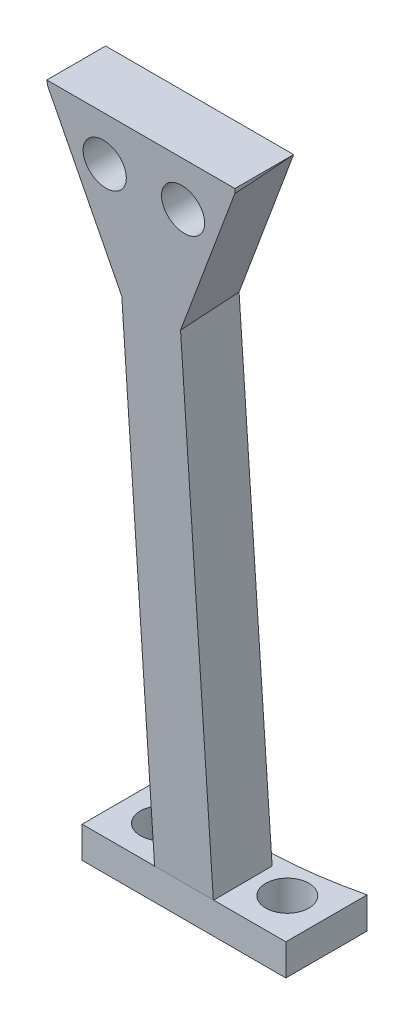
ISO-10303-21;
HEADER;
FILE_DESCRIPTION(('STEP AP214'),'2;1');
FILE_NAME('part.step','',(''),(''),'','','');
FILE_SCHEMA(('AUTOMOTIVE_DESIGN { 1 0 10303 214 1 1 1 1 }'));
ENDSEC;
DATA;
#1=APPLICATION_CONTEXT('core data for automotive mechanical design processes');
#2=APPLICATION_PROTOCOL_DEFINITION('international standard','automotive_design',2000,#1);
#3=PRODUCT_CONTEXT('',#1,'mechanical');
#4=PRODUCT('Part','Part','',(#3));
#5=PRODUCT_RELATED_PRODUCT_CATEGORY('part','',(#4));
#6=PRODUCT_DEFINITION_FORMATION('','',#4);
#7=PRODUCT_DEFINITION_CONTEXT('part definition',#1,'design');
#8=PRODUCT_DEFINITION('design','',#6,#7);
#9=PRODUCT_DEFINITION_SHAPE('','',#8);
#10=(LENGTH_UNIT() NAMED_UNIT(*) SI_UNIT(.MILLI.,.METRE.));
#11=(NAMED_UNIT(*) PLANE_ANGLE_UNIT() SI_UNIT($,.RADIAN.));
#12=(NAMED_UNIT(*) SI_UNIT($,.STERADIAN.) SOLID_ANGLE_UNIT());
#13=UNCERTAINTY_MEASURE_WITH_UNIT(LENGTH_MEASURE(1.E-05),#10,'distance_accuracy_value','');
#14=(GEOMETRIC_REPRESENTATION_CONTEXT(3) GLOBAL_UNCERTAINTY_ASSIGNED_CONTEXT((#13)) GLOBAL_UNIT_ASSIGNED_CONTEXT((#10,
#11,#12)) REPRESENTATION_CONTEXT('',''));
#15=CARTESIAN_POINT('',(0.,0.,0.));
#16=DIRECTION('',(0.,0.,1.));
#17=DIRECTION('',(1.,0.,0.));
#18=AXIS2_PLACEMENT_3D('',#15,#16,#17);
#19=CARTESIAN_POINT('',(6.5,2.,0.));
#20=DIRECTION('',(-1.,0.,0.));
#21=DIRECTION('',(0.,0.,1.));
#22=AXIS2_PLACEMENT_3D('',#19,#20,#21);
#23=PLANE('',#22);
#24=DIRECTION('',(0.,0.,-1.));
#25=VECTOR('',#24,1.);
#26=CARTESIAN_POINT('',(6.5,0.,0.));
#27=LINE('',#26,#25);
#28=CARTESIAN_POINT('',(6.5,0.,0.));
#29=VERTEX_POINT('',#28);
#30=CARTESIAN_POINT('',(6.5,0.,-5.19));
#31=VERTEX_POINT('',#30);
#32=EDGE_CURVE('E287',#29,#31,#27,.T.);
#33=ORIENTED_EDGE('',*,*,#32,.T.);
#34=DIRECTION('',(0.,-1.,0.));
#35=VECTOR('',#34,1.);
#36=CARTESIAN_POINT('',(6.5,2.,-5.19));
#37=LINE('',#36,#35);
#38=CARTESIAN_POINT('',(6.5,2.,-5.19));
#39=VERTEX_POINT('',#38);
#40=EDGE_CURVE('E339',#39,#31,#37,.T.);
#41=ORIENTED_EDGE('',*,*,#40,.F.);
#42=DIRECTION('',(0.,0.,-1.));
#43=VECTOR('',#42,1.);
#44=CARTESIAN_POINT('',(6.5,2.,0.));
#45=LINE('',#44,#43);
#46=CARTESIAN_POINT('',(6.5,2.,0.));
#47=VERTEX_POINT('',#46);
#48=EDGE_CURVE('E297',#47,#39,#45,.T.);
#49=ORIENTED_EDGE('',*,*,#48,.F.);
#50=DIRECTION('',(0.,-1.,0.));
#51=VECTOR('',#50,1.);
#52=CARTESIAN_POINT('',(6.5,2.,0.));
#53=LINE('',#52,#51);
#54=EDGE_CURVE('E340',#47,#29,#53,.T.);
#55=ORIENTED_EDGE('',*,*,#54,.T.);
#56=EDGE_LOOP('',(#33,#41,#49,#55));
#57=FACE_BOUND('',#56,.T.);
#58=ADVANCED_FACE('F49',(#57),#23,.F.);
#59=CARTESIAN_POINT('',(6.5,2.,-5.19));
#60=CARTESIAN_POINT('',(0.,2.,-3.63));
#61=CARTESIAN_POINT('',(-6.5,2.,-5.19));
#62=B_SPLINE_CURVE_WITH_KNOTS('',2,(#59,#60,#61),.UNSPECIFIED.,.F.,.F.,(3,3),(0.,1.),.UNSPECIFIED.);
#63=DIRECTION('',(0.,-1.,0.));
#64=VECTOR('',#63,1.);
#65=SURFACE_OF_LINEAR_EXTRUSION('',#62,#64);
#66=CARTESIAN_POINT('',(6.5,0.,-5.19));
#67=CARTESIAN_POINT('',(0.,0.,-3.63));
#68=CARTESIAN_POINT('',(-6.5,0.,-5.19));
#69=B_SPLINE_CURVE_WITH_KNOTS('',2,(#66,#67,#68),.UNSPECIFIED.,.F.,.F.,(3,3),(0.,1.),.UNSPECIFIED.);
#70=CARTESIAN_POINT('',(-6.5,0.,-5.19));
#71=VERTEX_POINT('',#70);
#72=EDGE_CURVE('E342',#31,#71,#69,.T.);
#73=ORIENTED_EDGE('',*,*,#72,.T.);
#74=DIRECTION('',(0.,-1.,0.));
#75=VECTOR('',#74,1.);
#76=CARTESIAN_POINT('',(-6.5,2.,-5.19));
#77=LINE('',#76,#75);
#78=CARTESIAN_POINT('',(-6.5,2.,-5.19));
#79=VERTEX_POINT('',#78);
#80=EDGE_CURVE('E357',#79,#71,#77,.T.);
#81=ORIENTED_EDGE('',*,*,#80,.F.);
#82=EDGE_CURVE('E100',#39,#79,#62,.T.);
#83=ORIENTED_EDGE('',*,*,#82,.F.);
#84=ORIENTED_EDGE('',*,*,#40,.T.);
#85=EDGE_LOOP('',(#73,#81,#83,#84));
#86=FACE_BOUND('',#85,.T.);
#87=ADVANCED_FACE('F307',(#86),#65,.F.);
#88=CARTESIAN_POINT('',(-6.5,2.,0.));
#89=DIRECTION('',(1.,0.,0.));
#90=DIRECTION('',(0.,0.,-1.));
#91=AXIS2_PLACEMENT_3D('',#88,#89,#90);
#92=PLANE('',#91);
#93=DIRECTION('',(0.,0.,1.));
#94=VECTOR('',#93,1.);
#95=CARTESIAN_POINT('',(-6.5,0.,0.));
#96=LINE('',#95,#94);
#97=CARTESIAN_POINT('',(-6.5,0.,0.));
#98=VERTEX_POINT('',#97);
#99=EDGE_CURVE('E86',#71,#98,#96,.T.);
#100=ORIENTED_EDGE('',*,*,#99,.T.);
#101=DIRECTION('',(0.,-1.,0.));
#102=VECTOR('',#101,1.);
#103=CARTESIAN_POINT('',(-6.5,2.,0.));
#104=LINE('',#103,#102);
#105=CARTESIAN_POINT('',(-6.5,2.,0.));
#106=VERTEX_POINT('',#105);
#107=EDGE_CURVE('E355',#106,#98,#104,.T.);
#108=ORIENTED_EDGE('',*,*,#107,.F.);
#109=DIRECTION('',(0.,0.,1.));
#110=VECTOR('',#109,1.);
#111=CARTESIAN_POINT('',(-6.5,2.,0.));
#112=LINE('',#111,#110);
#113=EDGE_CURVE('E303',#79,#106,#112,.T.);
#114=ORIENTED_EDGE('',*,*,#113,.F.);
#115=ORIENTED_EDGE('',*,*,#80,.T.);
#116=EDGE_LOOP('',(#100,#108,#114,#115));
#117=FACE_BOUND('',#116,.T.);
#118=ADVANCED_FACE('F310',(#117),#92,.F.);
#119=CARTESIAN_POINT('',(-6.5,2.,0.));
#120=DIRECTION('',(0.,0.,-1.));
#121=DIRECTION('',(-1.,0.,0.));
#122=AXIS2_PLACEMENT_3D('',#119,#120,#121);
#123=PLANE('',#122);
#124=DIRECTION('',(1.,0.,0.));
#125=VECTOR('',#124,1.);
#126=CARTESIAN_POINT('',(-6.5,2.,0.));
#127=LINE('',#126,#125);
#128=CARTESIAN_POINT('',(1.89818047135753,2.,0.));
#129=VERTEX_POINT('',#128);
#130=EDGE_CURVE('E67',#129,#47,#127,.T.);
#131=ORIENTED_EDGE('',*,*,#130,.F.);
#132=DIRECTION('',(-0.0956529764272899,-0.995414741753708,0.));
#133=VECTOR('',#132,1.);
#134=CARTESIAN_POINT('',(1.82134138716516,1.20037242953864,0.));
#135=LINE('',#134,#133);
#136=CARTESIAN_POINT('',(1.875,1.75877192982456,0.));
#137=VERTEX_POINT('',#136);
#138=EDGE_CURVE('E161',#129,#137,#135,.T.);
#139=ORIENTED_EDGE('',*,*,#138,.T.);
#140=DIRECTION('',(0.,1.,0.));
#141=VECTOR('',#140,1.);
#142=CARTESIAN_POINT('',(1.875,2.,0.));
#143=LINE('',#142,#141);
#144=CARTESIAN_POINT('',(1.875,2.00000000000002,0.));
#145=VERTEX_POINT('',#144);
#146=EDGE_CURVE('E173',#137,#145,#143,.T.);
#147=ORIENTED_EDGE('',*,*,#146,.T.);
#148=DIRECTION('',(1.,0.,0.));
#149=VECTOR('',#148,1.);
#150=CARTESIAN_POINT('',(-1.875,2.,0.));
#151=LINE('',#150,#149);
#152=CARTESIAN_POINT('',(-1.875,2.,0.));
#153=VERTEX_POINT('',#152);
#154=EDGE_CURVE('E190',#153,#145,#151,.T.);
#155=ORIENTED_EDGE('',*,*,#154,.F.);
#156=DIRECTION('',(0.,-1.,0.));
#157=VECTOR('',#156,1.);
#158=CARTESIAN_POINT('',(-1.875,2.,0.));
#159=LINE('',#158,#157);
#160=CARTESIAN_POINT('',(-1.875,1.75877192982456,0.));
#161=VERTEX_POINT('',#160);
#162=EDGE_CURVE('E405',#153,#161,#159,.T.);
#163=ORIENTED_EDGE('',*,*,#162,.T.);
#164=DIRECTION('',(-0.0956529764272899,0.995414741753708,0.));
#165=VECTOR('',#164,1.);
#166=CARTESIAN_POINT('',(-1.94028478185735,2.43815940630711,0.));
#167=LINE('',#166,#165);
#168=CARTESIAN_POINT('',(-1.89818047135754,2.,0.));
#169=VERTEX_POINT('',#168);
#170=EDGE_CURVE('E195',#161,#169,#167,.T.);
#171=ORIENTED_EDGE('',*,*,#170,.T.);
#172=EDGE_CURVE('E199',#106,#169,#127,.T.);
#173=ORIENTED_EDGE('',*,*,#172,.F.);
#174=ORIENTED_EDGE('',*,*,#107,.T.);
#175=DIRECTION('',(1.,0.,0.));
#176=VECTOR('',#175,1.);
#177=CARTESIAN_POINT('',(-6.5,0.,0.));
#178=LINE('',#177,#176);
#179=EDGE_CURVE('E92',#98,#29,#178,.T.);
#180=ORIENTED_EDGE('',*,*,#179,.T.);
#181=ORIENTED_EDGE('',*,*,#54,.F.);
#182=EDGE_LOOP('',(#131,#139,#147,#155,#163,#171,#173,#174,#180,#181));
#183=FACE_BOUND('',#182,.T.);
#184=ADVANCED_FACE('F313',(#183),#123,.F.);
#185=CARTESIAN_POINT('',(0.,2.,-4.41));
#186=DIRECTION('',(0.,-1.,0.));
#187=DIRECTION('',(0.,0.,-1.));
#188=AXIS2_PLACEMENT_3D('',#185,#186,#187);
#189=PLANE('',#188);
#190=CARTESIAN_POINT('',(-4.,2.,-2.595));
#191=DIRECTION('',(0.,1.,0.));
#192=DIRECTION('',(0.,0.,1.));
#193=AXIS2_PLACEMENT_3D('',#190,#191,#192);
#194=CIRCLE('',#193,1.375);
#195=CARTESIAN_POINT('',(-4.,2.,-1.22));
#196=VERTEX_POINT('',#195);
#197=EDGE_CURVE('E288',#196,#196,#194,.T.);
#198=ORIENTED_EDGE('',*,*,#197,.F.);
#199=EDGE_LOOP('',(#198));
#200=FACE_BOUND('',#199,.T.);
#201=CARTESIAN_POINT('',(4.,2.,-2.595));
#202=DIRECTION('',(0.,1.,0.));
#203=DIRECTION('',(0.,0.,1.));
#204=AXIS2_PLACEMENT_3D('',#201,#202,#203);
#205=CIRCLE('',#204,1.375);
#206=CARTESIAN_POINT('',(4.,2.,-1.22));
#207=VERTEX_POINT('',#206);
#208=EDGE_CURVE('E291',#207,#207,#205,.T.);
#209=ORIENTED_EDGE('',*,*,#208,.F.);
#210=EDGE_LOOP('',(#209));
#211=FACE_BOUND('',#210,.T.);
#212=DIRECTION('',(-1.,0.,0.));
#213=VECTOR('',#212,1.);
#214=CARTESIAN_POINT('',(-1.875,2.,-3.75));
#215=LINE('',#214,#213);
#216=CARTESIAN_POINT('',(1.875,2.,-3.75));
#217=VERTEX_POINT('',#216);
#218=CARTESIAN_POINT('',(-1.875,2.,-3.75));
#219=VERTEX_POINT('',#218);
#220=EDGE_CURVE('E182',#217,#219,#215,.T.);
#221=ORIENTED_EDGE('',*,*,#220,.F.);
#222=DIRECTION('',(0.0061813409339394,0.,0.999980895329635));
#223=VECTOR('',#222,1.);
#224=CARTESIAN_POINT('',(1.87084875109512,2.,-4.42156457490374));
#225=LINE('',#224,#223);
#226=EDGE_CURVE('E156',#217,#129,#225,.T.);
#227=ORIENTED_EDGE('',*,*,#226,.T.);
#228=ORIENTED_EDGE('',*,*,#130,.T.);
#229=ORIENTED_EDGE('',*,*,#48,.T.);
#230=ORIENTED_EDGE('',*,*,#82,.T.);
#231=ORIENTED_EDGE('',*,*,#113,.T.);
#232=ORIENTED_EDGE('',*,*,#172,.T.);
#233=DIRECTION('',(0.0061813409339394,0.,-0.999980895329635));
#234=VECTOR('',#233,1.);
#235=CARTESIAN_POINT('',(-1.87084875109512,2.,-4.42156457490374));
#236=LINE('',#235,#234);
#237=EDGE_CURVE('E188',#169,#219,#236,.T.);
#238=ORIENTED_EDGE('',*,*,#237,.T.);
#239=EDGE_LOOP('',(#221,#227,#228,#229,#230,#231,#232,#238));
#240=FACE_BOUND('',#239,.T.);
#241=ADVANCED_FACE('F186',(#200,#211,#240),#189,.F.);
#242=CARTESIAN_POINT('',(0.,0.,-4.41));
#243=DIRECTION('',(0.,-1.,0.));
#244=DIRECTION('',(0.,0.,-1.));
#245=AXIS2_PLACEMENT_3D('',#242,#243,#244);
#246=PLANE('',#245);
#247=CARTESIAN_POINT('',(-4.,0.,-2.595));
#248=DIRECTION('',(0.,1.,0.));
#249=DIRECTION('',(0.,0.,1.));
#250=AXIS2_PLACEMENT_3D('',#247,#248,#249);
#251=CIRCLE('',#250,1.375);
#252=CARTESIAN_POINT('',(-4.,0.,-1.22));
#253=VERTEX_POINT('',#252);
#254=EDGE_CURVE('E279',#253,#253,#251,.T.);
#255=ORIENTED_EDGE('',*,*,#254,.T.);
#256=EDGE_LOOP('',(#255));
#257=FACE_BOUND('',#256,.T.);
#258=CARTESIAN_POINT('',(4.,0.,-2.595));
#259=DIRECTION('',(0.,1.,0.));
#260=DIRECTION('',(0.,0.,1.));
#261=AXIS2_PLACEMENT_3D('',#258,#259,#260);
#262=CIRCLE('',#261,1.375);
#263=CARTESIAN_POINT('',(4.,0.,-1.22));
#264=VERTEX_POINT('',#263);
#265=EDGE_CURVE('E294',#264,#264,#262,.T.);
#266=ORIENTED_EDGE('',*,*,#265,.T.);
#267=EDGE_LOOP('',(#266));
#268=FACE_BOUND('',#267,.T.);
#269=ORIENTED_EDGE('',*,*,#32,.F.);
#270=ORIENTED_EDGE('',*,*,#179,.F.);
#271=ORIENTED_EDGE('',*,*,#99,.F.);
#272=ORIENTED_EDGE('',*,*,#72,.F.);
#273=EDGE_LOOP('',(#269,#270,#271,#272));
#274=FACE_BOUND('',#273,.T.);
#275=ADVANCED_FACE('F316',(#257,#268,#274),#246,.T.);
#276=CARTESIAN_POINT('',(4.,0.,-2.595));
#277=DIRECTION('',(0.,1.,0.));
#278=DIRECTION('',(0.,0.,1.));
#279=AXIS2_PLACEMENT_3D('',#276,#277,#278);
#280=CYLINDRICAL_SURFACE('',#279,1.375);
#281=ORIENTED_EDGE('',*,*,#265,.F.);
#282=EDGE_LOOP('',(#281));
#283=FACE_BOUND('',#282,.T.);
#284=ORIENTED_EDGE('',*,*,#208,.T.);
#285=EDGE_LOOP('',(#284));
#286=FACE_BOUND('',#285,.T.);
#287=ADVANCED_FACE('F319',(#283,#286),#280,.F.);
#288=CARTESIAN_POINT('',(-4.,0.,-2.595));
#289=DIRECTION('',(0.,1.,0.));
#290=DIRECTION('',(0.,0.,1.));
#291=AXIS2_PLACEMENT_3D('',#288,#289,#290);
#292=CYLINDRICAL_SURFACE('',#291,1.375);
#293=ORIENTED_EDGE('',*,*,#254,.F.);
#294=EDGE_LOOP('',(#293));
#295=FACE_BOUND('',#294,.T.);
#296=ORIENTED_EDGE('',*,*,#197,.T.);
#297=EDGE_LOOP('',(#296));
#298=FACE_BOUND('',#297,.T.);
#299=ADVANCED_FACE('F247',(#295,#298),#292,.F.);
#300=CARTESIAN_POINT('',(0.,44.75,0.));
#301=DIRECTION('',(0.,1.,0.));
#302=DIRECTION('',(0.,0.,1.));
#303=AXIS2_PLACEMENT_3D('',#300,#301,#302);
#304=PLANE('',#303);
#305=DIRECTION('',(1.,0.,0.));
#306=VECTOR('',#305,1.);
#307=CARTESIAN_POINT('',(6.,44.75,2.75));
#308=LINE('',#307,#306);
#309=CARTESIAN_POINT('',(-6.,44.75,2.75));
#310=VERTEX_POINT('',#309);
#311=CARTESIAN_POINT('',(6.,44.75,2.75));
#312=VERTEX_POINT('',#311);
#313=EDGE_CURVE('E208',#310,#312,#308,.T.);
#314=ORIENTED_EDGE('',*,*,#313,.T.);
#315=DIRECTION('',(0.,0.,-1.));
#316=VECTOR('',#315,1.);
#317=CARTESIAN_POINT('',(6.,44.75,2.75));
#318=LINE('',#317,#316);
#319=CARTESIAN_POINT('',(6.,44.75,-1.));
#320=VERTEX_POINT('',#319);
#321=EDGE_CURVE('E222',#312,#320,#318,.T.);
#322=ORIENTED_EDGE('',*,*,#321,.T.);
#323=DIRECTION('',(-1.,0.,0.));
#324=VECTOR('',#323,1.);
#325=CARTESIAN_POINT('',(-6.,44.75,-1.));
#326=LINE('',#325,#324);
#327=CARTESIAN_POINT('',(-6.,44.75,-1.));
#328=VERTEX_POINT('',#327);
#329=EDGE_CURVE('E370',#320,#328,#326,.T.);
#330=ORIENTED_EDGE('',*,*,#329,.T.);
#331=DIRECTION('',(0.,0.,1.));
#332=VECTOR('',#331,1.);
#333=CARTESIAN_POINT('',(-6.,44.75,-1.));
#334=LINE('',#333,#332);
#335=EDGE_CURVE('E379',#328,#310,#334,.T.);
#336=ORIENTED_EDGE('',*,*,#335,.T.);
#337=EDGE_LOOP('',(#314,#322,#330,#336));
#338=FACE_BOUND('',#337,.T.);
#339=ADVANCED_FACE('F242',(#338),#304,.T.);
#340=CARTESIAN_POINT('',(-1.66650148662042,-0.160802775024777,0.));
#341=DIRECTION('',(0.99537697869942,0.0960451470674879,0.));
#342=DIRECTION('',(-0.0960451470674879,0.99537697869942,0.));
#343=AXIS2_PLACEMENT_3D('',#340,#341,#342);
#344=PLANE('',#343);
#345=ORIENTED_EDGE('',*,*,#335,.F.);
#346=DIRECTION('',(0.00807870217686674,-0.0837247316511595,0.996456172584163));
#347=VECTOR('',#346,1.);
#348=CARTESIAN_POINT('',(-5.96129000883603,44.3488237279371,3.77462948770056));
#349=LINE('',#348,#347);
#350=CARTESIAN_POINT('',(-5.96976056708703,44.4366095134474,2.72984037805802));
#351=VERTEX_POINT('',#350);
#352=EDGE_CURVE('E395',#328,#351,#349,.T.);
#353=ORIENTED_EDGE('',*,*,#352,.T.);
#354=DIRECTION('',(-0.0958488648937648,0.99334278162629,0.0638992432625099));
#355=VECTOR('',#354,1.);
#356=CARTESIAN_POINT('',(-1.875,2.,0.));
#357=LINE('',#356,#355);
#358=EDGE_CURVE('E189',#351,#310,#357,.T.);
#359=ORIENTED_EDGE('',*,*,#358,.T.);
#360=EDGE_LOOP('',(#345,#353,#359));
#361=FACE_BOUND('',#360,.T.);
#362=ADVANCED_FACE('F246',(#361),#344,.F.);
#363=CARTESIAN_POINT('',(0.,0.24847592125877,-3.86267113956815));
#364=DIRECTION('',(0.,-0.0641948026384095,0.997937386469821));
#365=DIRECTION('',(0.,-0.997937386469821,-0.0641948026384095));
#366=AXIS2_PLACEMENT_3D('',#363,#364,#365);
#367=PLANE('',#366);
#368=CARTESIAN_POINT('',(-2.5,41.75,-1.19298245614035));
#369=DIRECTION('',(0.,-0.0641948026384095,0.997937386469821));
#370=DIRECTION('',(0.,0.997937386469821,0.0641948026384095));
#371=AXIS2_PLACEMENT_3D('',#368,#369,#370);
#372=ELLIPSE('',#371,1.37784195545978,1.375);
#373=CARTESIAN_POINT('',(-2.5,43.125,-1.10453216374269));
#374=VERTEX_POINT('',#373);
#375=EDGE_CURVE('E415',#374,#374,#372,.T.);
#376=ORIENTED_EDGE('',*,*,#375,.T.);
#377=EDGE_LOOP('',(#376));
#378=FACE_BOUND('',#377,.T.);
#379=CARTESIAN_POINT('',(2.5,41.75,-1.19298245614035));
#380=DIRECTION('',(0.,-0.0641948026384095,0.997937386469821));
#381=DIRECTION('',(0.,0.997937386469821,0.0641948026384095));
#382=AXIS2_PLACEMENT_3D('',#379,#380,#381);
#383=ELLIPSE('',#382,1.37784195545978,1.375);
#384=CARTESIAN_POINT('',(2.5,43.125,-1.10453216374269));
#385=VERTEX_POINT('',#384);
#386=EDGE_CURVE('E422',#385,#385,#383,.T.);
#387=ORIENTED_EDGE('',*,*,#386,.T.);
#388=EDGE_LOOP('',(#387));
#389=FACE_BOUND('',#388,.T.);
#390=ORIENTED_EDGE('',*,*,#329,.F.);
#391=DIRECTION('',(0.381330922952895,0.922531841531483,0.0593441535488088));
#392=VECTOR('',#391,1.);
#393=CARTESIAN_POINT('',(6.,44.75,-1.));
#394=LINE('',#393,#392);
#395=CARTESIAN_POINT('',(1.875,34.7706261353018,-1.6419480263841));
#396=VERTEX_POINT('',#395);
#397=EDGE_CURVE('E175',#396,#320,#394,.T.);
#398=ORIENTED_EDGE('',*,*,#397,.F.);
#399=DIRECTION('',(0.,0.99793738646982,0.0641948026384095));
#400=VECTOR('',#399,1.);
#401=CARTESIAN_POINT('',(1.875,2.,-3.75));
#402=LINE('',#401,#400);
#403=EDGE_CURVE('E170',#217,#396,#402,.T.);
#404=ORIENTED_EDGE('',*,*,#403,.F.);
#405=ORIENTED_EDGE('',*,*,#220,.T.);
#406=DIRECTION('',(0.,-0.99793738646982,-0.0641948026384095));
#407=VECTOR('',#406,1.);
#408=CARTESIAN_POINT('',(-1.87499999999999,34.7706261353018,-1.6419480263841));
#409=LINE('',#408,#407);
#410=CARTESIAN_POINT('',(-1.87499999999999,34.7706261353018,-1.6419480263841));
#411=VERTEX_POINT('',#410);
#412=EDGE_CURVE('E413',#411,#219,#409,.T.);
#413=ORIENTED_EDGE('',*,*,#412,.F.);
#414=DIRECTION('',(0.381330922952895,-0.922531841531482,-0.0593441535488088));
#415=VECTOR('',#414,1.);
#416=CARTESIAN_POINT('',(-6.,44.75,-1.));
#417=LINE('',#416,#415);
#418=EDGE_CURVE('E183',#328,#411,#417,.T.);
#419=ORIENTED_EDGE('',*,*,#418,.F.);
#420=EDGE_LOOP('',(#390,#398,#404,#405,#413,#419));
#421=FACE_BOUND('',#420,.T.);
#422=ADVANCED_FACE('F180',(#378,#389,#421),#367,.F.);
#423=CARTESIAN_POINT('',(0.,0.0082419453715687,-0.128124787139841));
#424=DIRECTION('',(0.,0.0641948026384095,-0.997937386469821));
#425=DIRECTION('',(0.,0.997937386469821,0.0641948026384095));
#426=AXIS2_PLACEMENT_3D('',#423,#424,#425);
#427=PLANE('',#426);
#428=CARTESIAN_POINT('',(-2.5,41.75,2.55701754385965));
#429=DIRECTION('',(0.,0.0641948026384095,-0.997937386469821));
#430=DIRECTION('',(0.,0.997937386469821,0.0641948026384095));
#431=AXIS2_PLACEMENT_3D('',#428,#429,#430);
#432=ELLIPSE('',#431,1.37784195545978,1.375);
#433=CARTESIAN_POINT('',(-2.5,43.125,2.64546783625731));
#434=VERTEX_POINT('',#433);
#435=EDGE_CURVE('E52',#434,#434,#432,.T.);
#436=ORIENTED_EDGE('',*,*,#435,.T.);
#437=EDGE_LOOP('',(#436));
#438=FACE_BOUND('',#437,.T.);
#439=CARTESIAN_POINT('',(2.5,41.75,2.55701754385965));
#440=DIRECTION('',(0.,0.0641948026384095,-0.997937386469821));
#441=DIRECTION('',(0.,0.997937386469821,0.0641948026384095));
#442=AXIS2_PLACEMENT_3D('',#439,#440,#441);
#443=ELLIPSE('',#442,1.37784195545978,1.375);
#444=CARTESIAN_POINT('',(2.5,43.125,2.64546783625731));
#445=VERTEX_POINT('',#444);
#446=EDGE_CURVE('E450',#445,#445,#443,.T.);
#447=ORIENTED_EDGE('',*,*,#446,.T.);
#448=EDGE_LOOP('',(#447));
#449=FACE_BOUND('',#448,.T.);
#450=DIRECTION('',(0.,0.997937386469821,0.0641948026384095));
#451=VECTOR('',#450,1.);
#452=CARTESIAN_POINT('',(1.875,0.0082419453715687,-0.128124787139841));
#453=LINE('',#452,#451);
#454=CARTESIAN_POINT('',(1.875,34.5303921594146,2.09259832604421));
#455=VERTEX_POINT('',#454);
#456=EDGE_CURVE('E425',#145,#455,#453,.T.);
#457=ORIENTED_EDGE('',*,*,#456,.T.);
#458=DIRECTION('',(0.381330922952895,0.922531841531483,0.0593441535488088));
#459=VECTOR('',#458,1.);
#460=CARTESIAN_POINT('',(-10.5924487326184,4.36861469474628,0.152367027147422));
#461=LINE('',#460,#459);
#462=CARTESIAN_POINT('',(5.96976056708702,44.4366095134474,2.72984037805802));
#463=VERTEX_POINT('',#462);
#464=EDGE_CURVE('E163',#455,#463,#461,.T.);
#465=ORIENTED_EDGE('',*,*,#464,.T.);
#466=DIRECTION('',(0.0958488648937648,0.99334278162629,0.0638992432625099));
#467=VECTOR('',#466,1.);
#468=CARTESIAN_POINT('',(1.875,2.,0.));
#469=LINE('',#468,#467);
#470=EDGE_CURVE('E192',#463,#312,#469,.T.);
#471=ORIENTED_EDGE('',*,*,#470,.T.);
#472=ORIENTED_EDGE('',*,*,#313,.F.);
#473=ORIENTED_EDGE('',*,*,#358,.F.);
#474=DIRECTION('',(0.381330922952895,-0.922531841531483,-0.0593441535488088));
#475=VECTOR('',#474,1.);
#476=CARTESIAN_POINT('',(10.5924487326184,4.36861469474629,0.152367027147422));
#477=LINE('',#476,#475);
#478=CARTESIAN_POINT('',(-1.87499999999999,34.5303921594146,2.09259832604421));
#479=VERTEX_POINT('',#478);
#480=EDGE_CURVE('E12',#351,#479,#477,.T.);
#481=ORIENTED_EDGE('',*,*,#480,.T.);
#482=DIRECTION('',(0.,-0.997937386469821,-0.0641948026384095));
#483=VECTOR('',#482,1.);
#484=CARTESIAN_POINT('',(-1.875,0.00824194537156895,-0.128124787139841));
#485=LINE('',#484,#483);
#486=EDGE_CURVE('E58',#479,#153,#485,.T.);
#487=ORIENTED_EDGE('',*,*,#486,.T.);
#488=ORIENTED_EDGE('',*,*,#154,.T.);
#489=EDGE_LOOP('',(#457,#465,#471,#472,#473,#481,#487,#488));
#490=FACE_BOUND('',#489,.T.);
#491=ADVANCED_FACE('F239',(#438,#449,#490),#427,.F.);
#492=CARTESIAN_POINT('',(1.66650148662041,-0.160802775024777,0.));
#493=DIRECTION('',(-0.99537697869942,0.0960451470674879,0.));
#494=DIRECTION('',(-0.0960451470674879,-0.99537697869942,0.));
#495=AXIS2_PLACEMENT_3D('',#492,#493,#494);
#496=PLANE('',#495);
#497=ORIENTED_EDGE('',*,*,#470,.F.);
#498=DIRECTION('',(0.00807870217686674,0.0837247316511596,-0.996456172584163));
#499=VECTOR('',#498,1.);
#500=CARTESIAN_POINT('',(5.96129000883603,44.3488237279371,3.77462948770057));
#501=LINE('',#500,#499);
#502=EDGE_CURVE('E209',#463,#320,#501,.T.);
#503=ORIENTED_EDGE('',*,*,#502,.T.);
#504=ORIENTED_EDGE('',*,*,#321,.F.);
#505=EDGE_LOOP('',(#497,#503,#504));
#506=FACE_BOUND('',#505,.T.);
#507=ADVANCED_FACE('F229',(#506),#496,.F.);
#508=CARTESIAN_POINT('',(6.,44.1080519736159,8.9793738646982));
#509=DIRECTION('',(0.995395898674782,-0.0956511657281826,-0.00615299896497081));
#510=DIRECTION('',(0.0956529764272899,0.995414741753708,0.));
#511=AXIS2_PLACEMENT_3D('',#508,#509,#510);
#512=PLANE('',#511);
#513=ORIENTED_EDGE('',*,*,#226,.F.);
#514=DIRECTION('',(0.,0.0641948026384095,-0.99793738646982));
#515=VECTOR('',#514,1.);
#516=CARTESIAN_POINT('',(1.875,1.35805197361591,6.2293738646982));
#517=LINE('',#516,#515);
#518=EDGE_CURVE('E159',#137,#217,#517,.T.);
#519=ORIENTED_EDGE('',*,*,#518,.F.);
#520=ORIENTED_EDGE('',*,*,#138,.F.);
#521=EDGE_LOOP('',(#513,#519,#520));
#522=FACE_BOUND('',#521,.T.);
#523=ADVANCED_FACE('F158',(#522),#512,.F.);
#524=CARTESIAN_POINT('',(6.,44.1080519736159,8.9793738646982));
#525=DIRECTION('',(-0.924438601097928,0.380544384631736,0.0244794633388836));
#526=DIRECTION('',(-0.380658455394938,-0.924715707845573,0.));
#527=AXIS2_PLACEMENT_3D('',#524,#525,#526);
#528=PLANE('',#527);
#529=DIRECTION('',(0.,0.0641948026384095,-0.99793738646982));
#530=VECTOR('',#529,1.);
#531=CARTESIAN_POINT('',(1.875,34.1286781089177,8.3374258383141));
#532=LINE('',#531,#530);
#533=EDGE_CURVE('E174',#455,#396,#532,.T.);
#534=ORIENTED_EDGE('',*,*,#533,.T.);
#535=ORIENTED_EDGE('',*,*,#397,.T.);
#536=ORIENTED_EDGE('',*,*,#502,.F.);
#537=ORIENTED_EDGE('',*,*,#464,.F.);
#538=EDGE_LOOP('',(#534,#535,#536,#537));
#539=FACE_BOUND('',#538,.T.);
#540=ADVANCED_FACE('F473',(#539),#528,.F.);
#541=CARTESIAN_POINT('',(1.875,1.35805197361591,6.2293738646982));
#542=DIRECTION('',(-1.,0.,0.));
#543=DIRECTION('',(0.,0.,1.));
#544=AXIS2_PLACEMENT_3D('',#541,#542,#543);
#545=PLANE('',#544);
#546=ORIENTED_EDGE('',*,*,#518,.T.);
#547=ORIENTED_EDGE('',*,*,#403,.T.);
#548=ORIENTED_EDGE('',*,*,#533,.F.);
#549=ORIENTED_EDGE('',*,*,#456,.F.);
#550=ORIENTED_EDGE('',*,*,#146,.F.);
#551=EDGE_LOOP('',(#546,#547,#548,#549,#550));
#552=FACE_BOUND('',#551,.T.);
#553=ADVANCED_FACE('F168',(#552),#545,.F.);
#554=CARTESIAN_POINT('',(-1.875,1.35805197361591,6.2293738646982));
#555=DIRECTION('',(-0.995395898674782,-0.0956511657281826,-0.00615299896497081));
#556=DIRECTION('',(0.0956529764272899,-0.995414741753708,0.));
#557=AXIS2_PLACEMENT_3D('',#554,#555,#556);
#558=PLANE('',#557);
#559=DIRECTION('',(0.,0.0641948026384095,-0.99793738646982));
#560=VECTOR('',#559,1.);
#561=CARTESIAN_POINT('',(-1.875,1.35805197361591,6.2293738646982));
#562=LINE('',#561,#560);
#563=EDGE_CURVE('E396',#161,#219,#562,.T.);
#564=ORIENTED_EDGE('',*,*,#563,.T.);
#565=ORIENTED_EDGE('',*,*,#237,.F.);
#566=ORIENTED_EDGE('',*,*,#170,.F.);
#567=EDGE_LOOP('',(#564,#565,#566));
#568=FACE_BOUND('',#567,.T.);
#569=ADVANCED_FACE('F409',(#568),#558,.F.);
#570=CARTESIAN_POINT('',(-6.,44.1080519736159,8.9793738646982));
#571=DIRECTION('',(0.924438601097928,0.380544384631737,0.0244794633388837));
#572=DIRECTION('',(-0.380658455394938,0.924715707845573,0.));
#573=AXIS2_PLACEMENT_3D('',#570,#571,#572);
#574=PLANE('',#573);
#575=ORIENTED_EDGE('',*,*,#418,.T.);
#576=DIRECTION('',(0.,0.0641948026384095,-0.99793738646982));
#577=VECTOR('',#576,1.);
#578=CARTESIAN_POINT('',(-1.87499999999999,34.1286781089177,8.3374258383141));
#579=LINE('',#578,#577);
#580=EDGE_CURVE('E414',#479,#411,#579,.T.);
#581=ORIENTED_EDGE('',*,*,#580,.F.);
#582=ORIENTED_EDGE('',*,*,#480,.F.);
#583=ORIENTED_EDGE('',*,*,#352,.F.);
#584=EDGE_LOOP('',(#575,#581,#582,#583));
#585=FACE_BOUND('',#584,.T.);
#586=ADVANCED_FACE('F470',(#585),#574,.F.);
#587=CARTESIAN_POINT('',(-1.87499999999999,34.1286781089177,8.3374258383141));
#588=DIRECTION('',(1.,0.,0.));
#589=DIRECTION('',(0.,1.,0.));
#590=AXIS2_PLACEMENT_3D('',#587,#588,#589);
#591=PLANE('',#590);
#592=ORIENTED_EDGE('',*,*,#162,.F.);
#593=ORIENTED_EDGE('',*,*,#486,.F.);
#594=ORIENTED_EDGE('',*,*,#580,.T.);
#595=ORIENTED_EDGE('',*,*,#412,.T.);
#596=ORIENTED_EDGE('',*,*,#563,.F.);
#597=EDGE_LOOP('',(#592,#593,#594,#595,#596));
#598=FACE_BOUND('',#597,.T.);
#599=ADVANCED_FACE('F412',(#598),#591,.F.);
#600=CARTESIAN_POINT('',(2.5,41.75,-5.19));
#601=DIRECTION('',(0.,0.,1.));
#602=DIRECTION('',(1.,0.,0.));
#603=AXIS2_PLACEMENT_3D('',#600,#601,#602);
#604=CYLINDRICAL_SURFACE('',#603,1.375);
#605=ORIENTED_EDGE('',*,*,#446,.F.);
#606=EDGE_LOOP('',(#605));
#607=FACE_BOUND('',#606,.T.);
#608=ORIENTED_EDGE('',*,*,#386,.F.);
#609=EDGE_LOOP('',(#608));
#610=FACE_BOUND('',#609,.T.);
#611=ADVANCED_FACE('F458',(#607,#610),#604,.F.);
#612=CARTESIAN_POINT('',(-2.5,41.75,-5.19));
#613=DIRECTION('',(0.,0.,1.));
#614=DIRECTION('',(1.,0.,0.));
#615=AXIS2_PLACEMENT_3D('',#612,#613,#614);
#616=CYLINDRICAL_SURFACE('',#615,1.375);
#617=ORIENTED_EDGE('',*,*,#435,.F.);
#618=EDGE_LOOP('',(#617));
#619=FACE_BOUND('',#618,.T.);
#620=ORIENTED_EDGE('',*,*,#375,.F.);
#621=EDGE_LOOP('',(#620));
#622=FACE_BOUND('',#621,.T.);
#623=ADVANCED_FACE('F460',(#619,#622),#616,.F.);
#624=CLOSED_SHELL('',(#58,#87,#118,#184,#241,#275,#287,#299,#339,#362,#422,#491,#507,#523,#540,
#553,#569,#586,#599,#611,#623));
#625=MANIFOLD_SOLID_BREP('B2',#624);
#626=ADVANCED_BREP_SHAPE_REPRESENTATION('',(#18,#625),#14);
#627=SHAPE_DEFINITION_REPRESENTATION(#9,#626);
ENDSEC;
END-ISO-10303-21;
